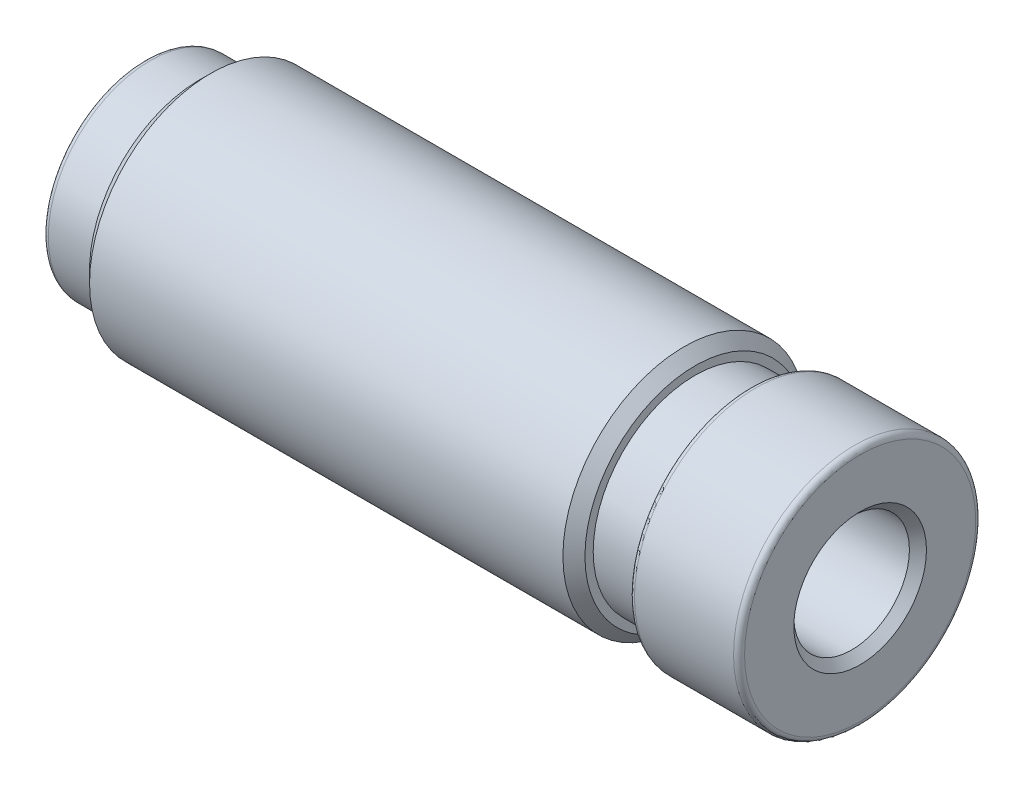
ISO-10303-21;
HEADER;
FILE_DESCRIPTION(('STEP AP214'),'2;1');
FILE_NAME('part.step','',(''),(''),'','','');
FILE_SCHEMA(('AUTOMOTIVE_DESIGN { 1 0 10303 214 1 1 1 1 }'));
ENDSEC;
DATA;
#1=APPLICATION_CONTEXT('core data for automotive mechanical design processes');
#2=APPLICATION_PROTOCOL_DEFINITION('international standard','automotive_design',2000,#1);
#3=PRODUCT_CONTEXT('',#1,'mechanical');
#4=PRODUCT('Part','Part','',(#3));
#5=PRODUCT_RELATED_PRODUCT_CATEGORY('part','',(#4));
#6=PRODUCT_DEFINITION_FORMATION('','',#4);
#7=PRODUCT_DEFINITION_CONTEXT('part definition',#1,'design');
#8=PRODUCT_DEFINITION('design','',#6,#7);
#9=PRODUCT_DEFINITION_SHAPE('','',#8);
#10=(LENGTH_UNIT() NAMED_UNIT(*) SI_UNIT(.MILLI.,.METRE.));
#11=(NAMED_UNIT(*) PLANE_ANGLE_UNIT() SI_UNIT($,.RADIAN.));
#12=(NAMED_UNIT(*) SI_UNIT($,.STERADIAN.) SOLID_ANGLE_UNIT());
#13=UNCERTAINTY_MEASURE_WITH_UNIT(LENGTH_MEASURE(1.E-05),#10,'distance_accuracy_value','');
#14=(GEOMETRIC_REPRESENTATION_CONTEXT(3) GLOBAL_UNCERTAINTY_ASSIGNED_CONTEXT((#13)) GLOBAL_UNIT_ASSIGNED_CONTEXT((#10,
#11,#12)) REPRESENTATION_CONTEXT('',''));
#15=CARTESIAN_POINT('',(0.,0.,0.));
#16=DIRECTION('',(0.,0.,1.));
#17=DIRECTION('',(1.,0.,0.));
#18=AXIS2_PLACEMENT_3D('',#15,#16,#17);
#19=CARTESIAN_POINT('',(0.,9.25,0.));
#20=DIRECTION('',(1.,0.,0.));
#21=DIRECTION('',(0.,0.,-1.));
#22=AXIS2_PLACEMENT_3D('',#19,#20,#21);
#23=PLANE('',#22);
#24=CARTESIAN_POINT('',(0.,0.,0.));
#25=DIRECTION('',(1.,0.,0.));
#26=DIRECTION('',(0.,0.,-1.));
#27=AXIS2_PLACEMENT_3D('',#24,#25,#26);
#28=CIRCLE('',#27,5.40000000000002);
#29=CARTESIAN_POINT('',(0.,0.,-5.40000000000002));
#30=VERTEX_POINT('',#29);
#31=EDGE_CURVE('E12',#30,#30,#28,.T.);
#32=ORIENTED_EDGE('',*,*,#31,.T.);
#33=EDGE_LOOP('',(#32));
#34=FACE_BOUND('',#33,.T.);
#35=CARTESIAN_POINT('',(0.,0.,0.));
#36=DIRECTION('',(1.,0.,0.));
#37=DIRECTION('',(0.,0.,-1.));
#38=AXIS2_PLACEMENT_3D('',#35,#36,#37);
#39=CIRCLE('',#38,8.75);
#40=CARTESIAN_POINT('',(0.,0.,-8.75));
#41=VERTEX_POINT('',#40);
#42=EDGE_CURVE('E79',#41,#41,#39,.F.);
#43=ORIENTED_EDGE('',*,*,#42,.T.);
#44=EDGE_LOOP('',(#43));
#45=FACE_BOUND('',#44,.T.);
#46=ADVANCED_FACE('F50',(#34,#45),#23,.F.);
#47=CARTESIAN_POINT('',(65.,0.,0.));
#48=DIRECTION('',(-1.,0.,0.));
#49=DIRECTION('',(0.,0.,1.));
#50=AXIS2_PLACEMENT_3D('',#47,#48,#49);
#51=PLANE('',#50);
#52=CARTESIAN_POINT('',(65.,0.,0.));
#53=DIRECTION('',(-1.,0.,0.));
#54=DIRECTION('',(0.,0.,1.));
#55=AXIS2_PLACEMENT_3D('',#52,#53,#54);
#56=CIRCLE('',#55,10.5);
#57=CARTESIAN_POINT('',(65.,0.,10.5));
#58=VERTEX_POINT('',#57);
#59=EDGE_CURVE('E65',#58,#58,#56,.F.);
#60=ORIENTED_EDGE('',*,*,#59,.T.);
#61=EDGE_LOOP('',(#60));
#62=FACE_BOUND('',#61,.T.);
#63=CARTESIAN_POINT('',(65.,0.,0.));
#64=DIRECTION('',(1.,0.,0.));
#65=DIRECTION('',(0.,0.,-1.));
#66=AXIS2_PLACEMENT_3D('',#63,#64,#65);
#67=CIRCLE('',#66,6.025);
#68=CARTESIAN_POINT('',(65.,0.,-6.025));
#69=VERTEX_POINT('',#68);
#70=EDGE_CURVE('E109',#69,#69,#67,.T.);
#71=ORIENTED_EDGE('',*,*,#70,.F.);
#72=EDGE_LOOP('',(#71));
#73=FACE_BOUND('',#72,.T.);
#74=ADVANCED_FACE('F135',(#62,#73),#51,.F.);
#75=CARTESIAN_POINT('',(0.,0.,0.));
#76=DIRECTION('',(-1.,0.,0.));
#77=DIRECTION('',(0.,0.,1.));
#78=AXIS2_PLACEMENT_3D('',#75,#76,#77);
#79=CYLINDRICAL_SURFACE('',#78,11.);
#80=CARTESIAN_POINT('',(64.5,0.,0.));
#81=DIRECTION('',(-1.,0.,0.));
#82=DIRECTION('',(0.,0.,1.));
#83=AXIS2_PLACEMENT_3D('',#80,#81,#82);
#84=CIRCLE('',#83,11.);
#85=CARTESIAN_POINT('',(64.5,0.,11.));
#86=VERTEX_POINT('',#85);
#87=EDGE_CURVE('E70',#86,#86,#84,.T.);
#88=ORIENTED_EDGE('',*,*,#87,.T.);
#89=EDGE_LOOP('',(#88));
#90=FACE_BOUND('',#89,.T.);
#91=CARTESIAN_POINT('',(55.5,0.,0.));
#92=DIRECTION('',(1.,0.,0.));
#93=DIRECTION('',(0.,0.,-1.));
#94=AXIS2_PLACEMENT_3D('',#91,#92,#93);
#95=CIRCLE('',#94,11.);
#96=CARTESIAN_POINT('',(55.5,0.,-11.));
#97=VERTEX_POINT('',#96);
#98=EDGE_CURVE('E73',#97,#97,#95,.T.);
#99=ORIENTED_EDGE('',*,*,#98,.T.);
#100=EDGE_LOOP('',(#99));
#101=FACE_BOUND('',#100,.T.);
#102=ADVANCED_FACE('F140',(#90,#101),#79,.T.);
#103=CARTESIAN_POINT('',(55.,11.,0.));
#104=DIRECTION('',(1.,0.,0.));
#105=DIRECTION('',(0.,0.,-1.));
#106=AXIS2_PLACEMENT_3D('',#103,#104,#105);
#107=PLANE('',#106);
#108=CARTESIAN_POINT('',(55.,0.,0.));
#109=DIRECTION('',(1.,0.,0.));
#110=DIRECTION('',(0.,0.,-1.));
#111=AXIS2_PLACEMENT_3D('',#108,#109,#110);
#112=CIRCLE('',#111,10.5);
#113=CARTESIAN_POINT('',(55.,0.,-10.5));
#114=VERTEX_POINT('',#113);
#115=EDGE_CURVE('E61',#114,#114,#112,.F.);
#116=ORIENTED_EDGE('',*,*,#115,.T.);
#117=EDGE_LOOP('',(#116));
#118=FACE_BOUND('',#117,.T.);
#119=CARTESIAN_POINT('',(55.,0.,0.));
#120=DIRECTION('',(-1.,0.,0.));
#121=DIRECTION('',(0.,0.,1.));
#122=AXIS2_PLACEMENT_3D('',#119,#120,#121);
#123=CIRCLE('',#122,9.25);
#124=CARTESIAN_POINT('',(55.,0.,9.25));
#125=VERTEX_POINT('',#124);
#126=EDGE_CURVE('E94',#125,#125,#123,.T.);
#127=ORIENTED_EDGE('',*,*,#126,.F.);
#128=EDGE_LOOP('',(#127));
#129=FACE_BOUND('',#128,.T.);
#130=ADVANCED_FACE('F167',(#118,#129),#107,.F.);
#131=CARTESIAN_POINT('',(0.,0.,0.));
#132=DIRECTION('',(-1.,0.,0.));
#133=DIRECTION('',(0.,0.,1.));
#134=AXIS2_PLACEMENT_3D('',#131,#132,#133);
#135=CYLINDRICAL_SURFACE('',#134,9.25);
#136=CARTESIAN_POINT('',(50.,0.,0.));
#137=DIRECTION('',(-1.,0.,0.));
#138=DIRECTION('',(0.,0.,1.));
#139=AXIS2_PLACEMENT_3D('',#136,#137,#138);
#140=CIRCLE('',#139,9.25);
#141=CARTESIAN_POINT('',(50.,0.,9.25));
#142=VERTEX_POINT('',#141);
#143=EDGE_CURVE('E97',#142,#142,#140,.T.);
#144=ORIENTED_EDGE('',*,*,#143,.F.);
#145=EDGE_LOOP('',(#144));
#146=FACE_BOUND('',#145,.T.);
#147=ORIENTED_EDGE('',*,*,#126,.T.);
#148=EDGE_LOOP('',(#147));
#149=FACE_BOUND('',#148,.T.);
#150=ADVANCED_FACE('F170',(#146,#149),#135,.T.);
#151=CARTESIAN_POINT('',(50.,9.25,0.));
#152=DIRECTION('',(-1.,0.,0.));
#153=DIRECTION('',(0.,0.,1.));
#154=AXIS2_PLACEMENT_3D('',#151,#152,#153);
#155=PLANE('',#154);
#156=CARTESIAN_POINT('',(50.,0.,0.));
#157=DIRECTION('',(-1.,0.,0.));
#158=DIRECTION('',(0.,0.,1.));
#159=AXIS2_PLACEMENT_3D('',#156,#157,#158);
#160=CIRCLE('',#159,9.99999999999998);
#161=CARTESIAN_POINT('',(50.,0.,9.99999999999998));
#162=VERTEX_POINT('',#161);
#163=EDGE_CURVE('E82',#162,#162,#160,.F.);
#164=ORIENTED_EDGE('',*,*,#163,.T.);
#165=EDGE_LOOP('',(#164));
#166=FACE_BOUND('',#165,.T.);
#167=ORIENTED_EDGE('',*,*,#143,.T.);
#168=EDGE_LOOP('',(#167));
#169=FACE_BOUND('',#168,.T.);
#170=ADVANCED_FACE('F175',(#166,#169),#155,.F.);
#171=CARTESIAN_POINT('',(0.,0.,0.));
#172=DIRECTION('',(-1.,0.,0.));
#173=DIRECTION('',(0.,0.,1.));
#174=AXIS2_PLACEMENT_3D('',#171,#172,#173);
#175=CYLINDRICAL_SURFACE('',#174,11.);
#176=CARTESIAN_POINT('',(49.,0.,0.));
#177=DIRECTION('',(-1.,0.,0.));
#178=DIRECTION('',(0.,0.,1.));
#179=AXIS2_PLACEMENT_3D('',#176,#177,#178);
#180=CIRCLE('',#179,11.);
#181=CARTESIAN_POINT('',(49.,0.,11.));
#182=VERTEX_POINT('',#181);
#183=EDGE_CURVE('E85',#182,#182,#180,.T.);
#184=ORIENTED_EDGE('',*,*,#183,.T.);
#185=EDGE_LOOP('',(#184));
#186=FACE_BOUND('',#185,.T.);
#187=CARTESIAN_POINT('',(6.00000000000002,0.,0.));
#188=DIRECTION('',(1.,0.,0.));
#189=DIRECTION('',(0.,0.,-1.));
#190=AXIS2_PLACEMENT_3D('',#187,#188,#189);
#191=CIRCLE('',#190,11.);
#192=CARTESIAN_POINT('',(6.00000000000002,0.,-11.));
#193=VERTEX_POINT('',#192);
#194=EDGE_CURVE('E88',#193,#193,#191,.T.);
#195=ORIENTED_EDGE('',*,*,#194,.T.);
#196=EDGE_LOOP('',(#195));
#197=FACE_BOUND('',#196,.T.);
#198=ADVANCED_FACE('F181',(#186,#197),#175,.T.);
#199=CARTESIAN_POINT('',(5.,11.,0.));
#200=DIRECTION('',(1.,0.,0.));
#201=DIRECTION('',(0.,0.,-1.));
#202=AXIS2_PLACEMENT_3D('',#199,#200,#201);
#203=PLANE('',#202);
#204=CARTESIAN_POINT('',(5.,0.,0.));
#205=DIRECTION('',(1.,0.,0.));
#206=DIRECTION('',(0.,0.,-1.));
#207=AXIS2_PLACEMENT_3D('',#204,#205,#206);
#208=CIRCLE('',#207,9.99999999999997);
#209=CARTESIAN_POINT('',(5.,0.,-9.99999999999997));
#210=VERTEX_POINT('',#209);
#211=EDGE_CURVE('E91',#210,#210,#208,.F.);
#212=ORIENTED_EDGE('',*,*,#211,.T.);
#213=EDGE_LOOP('',(#212));
#214=FACE_BOUND('',#213,.T.);
#215=CARTESIAN_POINT('',(5.,0.,0.));
#216=DIRECTION('',(-1.,0.,0.));
#217=DIRECTION('',(0.,0.,1.));
#218=AXIS2_PLACEMENT_3D('',#215,#216,#217);
#219=CIRCLE('',#218,9.25);
#220=CARTESIAN_POINT('',(5.,0.,9.25));
#221=VERTEX_POINT('',#220);
#222=EDGE_CURVE('E100',#221,#221,#219,.T.);
#223=ORIENTED_EDGE('',*,*,#222,.F.);
#224=EDGE_LOOP('',(#223));
#225=FACE_BOUND('',#224,.T.);
#226=ADVANCED_FACE('F213',(#214,#225),#203,.F.);
#227=CARTESIAN_POINT('',(0.,0.,0.));
#228=DIRECTION('',(-1.,0.,0.));
#229=DIRECTION('',(0.,0.,1.));
#230=AXIS2_PLACEMENT_3D('',#227,#228,#229);
#231=CYLINDRICAL_SURFACE('',#230,9.25);
#232=CARTESIAN_POINT('',(0.5,0.,0.));
#233=DIRECTION('',(1.,0.,0.));
#234=DIRECTION('',(0.,0.,-1.));
#235=AXIS2_PLACEMENT_3D('',#232,#233,#234);
#236=CIRCLE('',#235,9.25);
#237=CARTESIAN_POINT('',(0.5,0.,-9.25));
#238=VERTEX_POINT('',#237);
#239=EDGE_CURVE('E76',#238,#238,#236,.T.);
#240=ORIENTED_EDGE('',*,*,#239,.T.);
#241=EDGE_LOOP('',(#240));
#242=FACE_BOUND('',#241,.T.);
#243=ORIENTED_EDGE('',*,*,#222,.T.);
#244=EDGE_LOOP('',(#243));
#245=FACE_BOUND('',#244,.T.);
#246=ADVANCED_FACE('F208',(#242,#245),#231,.T.);
#247=CARTESIAN_POINT('',(23.5,0.,0.));
#248=DIRECTION('',(1.,0.,0.));
#249=DIRECTION('',(0.,0.,-1.));
#250=AXIS2_PLACEMENT_3D('',#247,#248,#249);
#251=CONICAL_SURFACE('',#250,5.24999999999999,1.02974425867665);
#252=CARTESIAN_POINT('',(23.2896987833404,0.,0.));
#253=DIRECTION('',(1.,0.,0.));
#254=DIRECTION('',(0.,0.,-1.));
#255=AXIS2_PLACEMENT_3D('',#252,#253,#254);
#256=CIRCLE('',#255,4.90000000000001);
#257=CARTESIAN_POINT('',(23.2896987833404,0.,-4.90000000000001));
#258=VERTEX_POINT('',#257);
#259=EDGE_CURVE('E112',#258,#258,#256,.F.);
#260=ORIENTED_EDGE('',*,*,#259,.T.);
#261=EDGE_LOOP('',(#260));
#262=FACE_BOUND('',#261,.T.);
#263=CARTESIAN_POINT('',(23.5,0.,0.));
#264=DIRECTION('',(1.,0.,0.));
#265=DIRECTION('',(0.,0.,-1.));
#266=AXIS2_PLACEMENT_3D('',#263,#264,#265);
#267=CIRCLE('',#266,5.24999999999999);
#268=CARTESIAN_POINT('',(23.5,0.,-5.24999999999999));
#269=VERTEX_POINT('',#268);
#270=EDGE_CURVE('E103',#269,#269,#267,.T.);
#271=ORIENTED_EDGE('',*,*,#270,.T.);
#272=EDGE_LOOP('',(#271));
#273=FACE_BOUND('',#272,.T.);
#274=ADVANCED_FACE('F116',(#262,#273),#251,.F.);
#275=CARTESIAN_POINT('',(65.,0.,0.));
#276=DIRECTION('',(1.,0.,0.));
#277=DIRECTION('',(0.,0.,-1.));
#278=AXIS2_PLACEMENT_3D('',#275,#276,#277);
#279=CYLINDRICAL_SURFACE('',#278,5.24999999999999);
#280=ORIENTED_EDGE('',*,*,#270,.F.);
#281=EDGE_LOOP('',(#280));
#282=FACE_BOUND('',#281,.T.);
#283=CARTESIAN_POINT('',(64.225,0.,0.));
#284=DIRECTION('',(1.,0.,0.));
#285=DIRECTION('',(0.,0.,-1.));
#286=AXIS2_PLACEMENT_3D('',#283,#284,#285);
#287=CIRCLE('',#286,5.25);
#288=CARTESIAN_POINT('',(64.225,0.,-5.25));
#289=VERTEX_POINT('',#288);
#290=EDGE_CURVE('E106',#289,#289,#287,.T.);
#291=ORIENTED_EDGE('',*,*,#290,.T.);
#292=EDGE_LOOP('',(#291));
#293=FACE_BOUND('',#292,.T.);
#294=ADVANCED_FACE('F131',(#282,#293),#279,.F.);
#295=CARTESIAN_POINT('',(65.,0.,0.));
#296=DIRECTION('',(1.,0.,0.));
#297=DIRECTION('',(0.,0.,-1.));
#298=AXIS2_PLACEMENT_3D('',#295,#296,#297);
#299=CONICAL_SURFACE('',#298,6.025,0.785398163397452);
#300=ORIENTED_EDGE('',*,*,#290,.F.);
#301=EDGE_LOOP('',(#300));
#302=FACE_BOUND('',#301,.T.);
#303=ORIENTED_EDGE('',*,*,#70,.T.);
#304=EDGE_LOOP('',(#303));
#305=FACE_BOUND('',#304,.T.);
#306=ADVANCED_FACE('F122',(#302,#305),#299,.F.);
#307=CARTESIAN_POINT('',(0.,0.,0.));
#308=DIRECTION('',(-1.,0.,0.));
#309=DIRECTION('',(0.,0.,1.));
#310=AXIS2_PLACEMENT_3D('',#307,#308,#309);
#311=CYLINDRICAL_SURFACE('',#310,4.90000000000001);
#312=CARTESIAN_POINT('',(0.500000000000013,0.,0.));
#313=DIRECTION('',(1.,0.,0.));
#314=DIRECTION('',(0.,0.,-1.));
#315=AXIS2_PLACEMENT_3D('',#312,#313,#314);
#316=CIRCLE('',#315,4.90000000000001);
#317=CARTESIAN_POINT('',(0.500000000000013,0.,-4.90000000000001));
#318=VERTEX_POINT('',#317);
#319=EDGE_CURVE('E57',#318,#318,#316,.F.);
#320=ORIENTED_EDGE('',*,*,#319,.T.);
#321=EDGE_LOOP('',(#320));
#322=FACE_BOUND('',#321,.T.);
#323=ORIENTED_EDGE('',*,*,#259,.F.);
#324=EDGE_LOOP('',(#323));
#325=FACE_BOUND('',#324,.T.);
#326=ADVANCED_FACE('F119',(#322,#325),#311,.F.);
#327=CARTESIAN_POINT('',(5.,0.,0.));
#328=DIRECTION('',(1.,0.,0.));
#329=DIRECTION('',(0.,0.,-1.));
#330=AXIS2_PLACEMENT_3D('',#327,#328,#329);
#331=CONICAL_SURFACE('',#330,9.99999999999997,0.78539816339745);
#332=ORIENTED_EDGE('',*,*,#194,.F.);
#333=EDGE_LOOP('',(#332));
#334=FACE_BOUND('',#333,.T.);
#335=ORIENTED_EDGE('',*,*,#211,.F.);
#336=EDGE_LOOP('',(#335));
#337=FACE_BOUND('',#336,.T.);
#338=ADVANCED_FACE('F121',(#334,#337),#331,.T.);
#339=CARTESIAN_POINT('',(49.,0.,0.));
#340=DIRECTION('',(-1.,0.,0.));
#341=DIRECTION('',(0.,0.,1.));
#342=AXIS2_PLACEMENT_3D('',#339,#340,#341);
#343=CONICAL_SURFACE('',#342,11.,0.785398163397455);
#344=ORIENTED_EDGE('',*,*,#163,.F.);
#345=EDGE_LOOP('',(#344));
#346=FACE_BOUND('',#345,.T.);
#347=ORIENTED_EDGE('',*,*,#183,.F.);
#348=EDGE_LOOP('',(#347));
#349=FACE_BOUND('',#348,.T.);
#350=ADVANCED_FACE('F128',(#346,#349),#343,.T.);
#351=CARTESIAN_POINT('',(0.5,0.,0.));
#352=DIRECTION('',(1.,0.,0.));
#353=DIRECTION('',(0.,0.,-1.));
#354=AXIS2_PLACEMENT_3D('',#351,#352,#353);
#355=TOROIDAL_SURFACE('',#354,8.75,0.5);
#356=ORIENTED_EDGE('',*,*,#239,.F.);
#357=EDGE_LOOP('',(#356));
#358=FACE_BOUND('',#357,.T.);
#359=ORIENTED_EDGE('',*,*,#42,.F.);
#360=EDGE_LOOP('',(#359));
#361=FACE_BOUND('',#360,.T.);
#362=ADVANCED_FACE('F148',(#358,#361),#355,.T.);
#363=CARTESIAN_POINT('',(64.5,0.,0.));
#364=DIRECTION('',(-1.,0.,0.));
#365=DIRECTION('',(0.,0.,1.));
#366=AXIS2_PLACEMENT_3D('',#363,#364,#365);
#367=TOROIDAL_SURFACE('',#366,10.5,0.5);
#368=ORIENTED_EDGE('',*,*,#59,.F.);
#369=EDGE_LOOP('',(#368));
#370=FACE_BOUND('',#369,.T.);
#371=ORIENTED_EDGE('',*,*,#87,.F.);
#372=EDGE_LOOP('',(#371));
#373=FACE_BOUND('',#372,.T.);
#374=ADVANCED_FACE('F152',(#370,#373),#367,.T.);
#375=CARTESIAN_POINT('',(55.5,0.,0.));
#376=DIRECTION('',(1.,0.,0.));
#377=DIRECTION('',(0.,0.,-1.));
#378=AXIS2_PLACEMENT_3D('',#375,#376,#377);
#379=TOROIDAL_SURFACE('',#378,10.5,0.5);
#380=ORIENTED_EDGE('',*,*,#98,.F.);
#381=EDGE_LOOP('',(#380));
#382=FACE_BOUND('',#381,.T.);
#383=ORIENTED_EDGE('',*,*,#115,.F.);
#384=EDGE_LOOP('',(#383));
#385=FACE_BOUND('',#384,.T.);
#386=ADVANCED_FACE('F155',(#382,#385),#379,.T.);
#387=CARTESIAN_POINT('',(0.500000000000013,0.,0.));
#388=DIRECTION('',(-1.,0.,0.));
#389=DIRECTION('',(0.,0.,1.));
#390=AXIS2_PLACEMENT_3D('',#387,#388,#389);
#391=CONICAL_SURFACE('',#390,4.90000000000001,0.785398163397445);
#392=ORIENTED_EDGE('',*,*,#31,.F.);
#393=EDGE_LOOP('',(#392));
#394=FACE_BOUND('',#393,.T.);
#395=ORIENTED_EDGE('',*,*,#319,.F.);
#396=EDGE_LOOP('',(#395));
#397=FACE_BOUND('',#396,.T.);
#398=ADVANCED_FACE('F52',(#394,#397),#391,.F.);
#399=CLOSED_SHELL('',(#46,#74,#102,#130,#150,#170,#198,#226,#246,#274,#294,#306,#326,#338,#350,
#362,#374,#386,#398));
#400=MANIFOLD_SOLID_BREP('B2',#399);
#401=ADVANCED_BREP_SHAPE_REPRESENTATION('',(#18,#400),#14);
#402=SHAPE_DEFINITION_REPRESENTATION(#9,#401);
ENDSEC;
END-ISO-10303-21;
